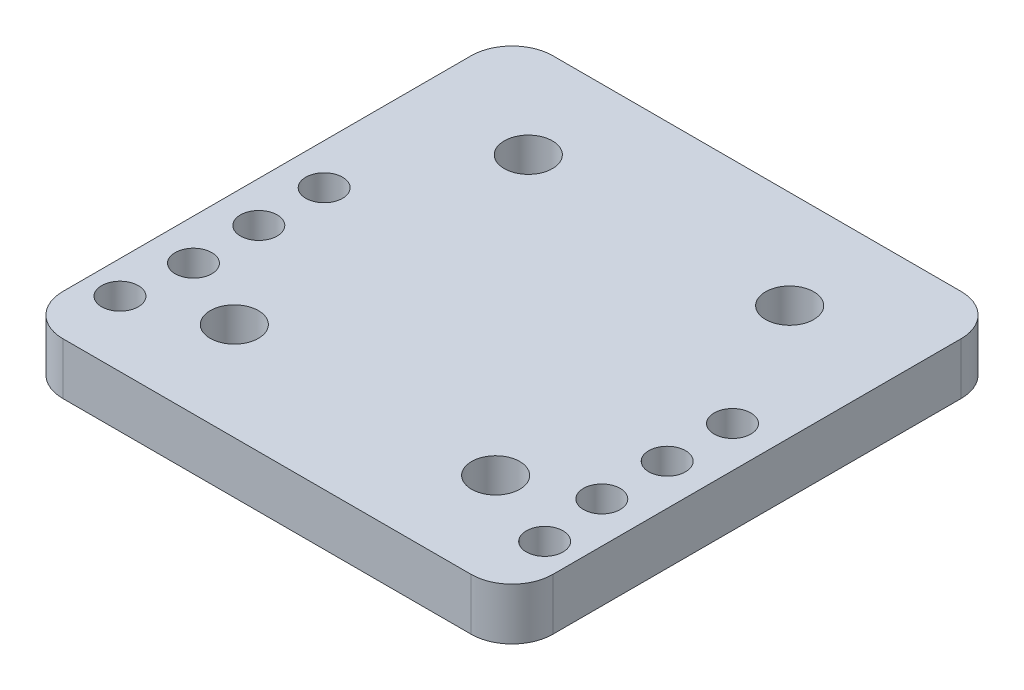
ISO-10303-21;
HEADER;
FILE_DESCRIPTION(('STEP AP214'),'2;1');
FILE_NAME('part.step','',(''),(''),'','','');
FILE_SCHEMA(('AUTOMOTIVE_DESIGN { 1 0 10303 214 1 1 1 1 }'));
ENDSEC;
DATA;
#1=APPLICATION_CONTEXT('core data for automotive mechanical design processes');
#2=APPLICATION_PROTOCOL_DEFINITION('international standard','automotive_design',2000,#1);
#3=PRODUCT_CONTEXT('',#1,'mechanical');
#4=PRODUCT('Part','Part','',(#3));
#5=PRODUCT_RELATED_PRODUCT_CATEGORY('part','',(#4));
#6=PRODUCT_DEFINITION_FORMATION('','',#4);
#7=PRODUCT_DEFINITION_CONTEXT('part definition',#1,'design');
#8=PRODUCT_DEFINITION('design','',#6,#7);
#9=PRODUCT_DEFINITION_SHAPE('','',#8);
#10=(LENGTH_UNIT() NAMED_UNIT(*) SI_UNIT(.MILLI.,.METRE.));
#11=(NAMED_UNIT(*) PLANE_ANGLE_UNIT() SI_UNIT($,.RADIAN.));
#12=(NAMED_UNIT(*) SI_UNIT($,.STERADIAN.) SOLID_ANGLE_UNIT());
#13=UNCERTAINTY_MEASURE_WITH_UNIT(LENGTH_MEASURE(1.E-05),#10,'distance_accuracy_value','');
#14=(GEOMETRIC_REPRESENTATION_CONTEXT(3) GLOBAL_UNCERTAINTY_ASSIGNED_CONTEXT((#13)) GLOBAL_UNIT_ASSIGNED_CONTEXT((#10,
#11,#12)) REPRESENTATION_CONTEXT('',''));
#15=CARTESIAN_POINT('',(0.,0.,0.));
#16=DIRECTION('',(0.,0.,1.));
#17=DIRECTION('',(1.,0.,0.));
#18=AXIS2_PLACEMENT_3D('',#15,#16,#17);
#19=CARTESIAN_POINT('',(0.,6.35,0.));
#20=DIRECTION('',(0.,-1.,0.));
#21=DIRECTION('',(0.,0.,-1.));
#22=AXIS2_PLACEMENT_3D('',#19,#20,#21);
#23=PLANE('',#22);
#24=DIRECTION('',(-1.,0.,0.));
#25=VECTOR('',#24,1.);
#26=CARTESIAN_POINT('',(0.,6.35,-60.));
#27=LINE('',#26,#25);
#28=CARTESIAN_POINT('',(55.,6.35,-60.));
#29=VERTEX_POINT('',#28);
#30=CARTESIAN_POINT('',(5.,6.35,-60.));
#31=VERTEX_POINT('',#30);
#32=EDGE_CURVE('E154',#29,#31,#27,.T.);
#33=ORIENTED_EDGE('',*,*,#32,.T.);
#34=CARTESIAN_POINT('',(5.,6.35,-55.));
#35=DIRECTION('',(0.,-1.,0.));
#36=DIRECTION('',(0.,0.,-1.));
#37=AXIS2_PLACEMENT_3D('',#34,#35,#36);
#38=CIRCLE('',#37,5.);
#39=CARTESIAN_POINT('',(0.,6.35,-55.));
#40=VERTEX_POINT('',#39);
#41=EDGE_CURVE('E183',#31,#40,#38,.F.);
#42=ORIENTED_EDGE('',*,*,#41,.T.);
#43=DIRECTION('',(0.,0.,1.));
#44=VECTOR('',#43,1.);
#45=CARTESIAN_POINT('',(0.,6.35,0.));
#46=LINE('',#45,#44);
#47=CARTESIAN_POINT('',(0.,6.35,-5.));
#48=VERTEX_POINT('',#47);
#49=EDGE_CURVE('E132',#40,#48,#46,.T.);
#50=ORIENTED_EDGE('',*,*,#49,.T.);
#51=CARTESIAN_POINT('',(5.,6.35,-5.));
#52=DIRECTION('',(0.,-1.,0.));
#53=DIRECTION('',(0.,0.,-1.));
#54=AXIS2_PLACEMENT_3D('',#51,#52,#53);
#55=CIRCLE('',#54,5.);
#56=CARTESIAN_POINT('',(5.,6.35,0.));
#57=VERTEX_POINT('',#56);
#58=EDGE_CURVE('E178',#48,#57,#55,.F.);
#59=ORIENTED_EDGE('',*,*,#58,.T.);
#60=DIRECTION('',(1.,0.,0.));
#61=VECTOR('',#60,1.);
#62=CARTESIAN_POINT('',(0.,6.35,0.));
#63=LINE('',#62,#61);
#64=CARTESIAN_POINT('',(55.,6.35,0.));
#65=VERTEX_POINT('',#64);
#66=EDGE_CURVE('E198',#57,#65,#63,.T.);
#67=ORIENTED_EDGE('',*,*,#66,.T.);
#68=CARTESIAN_POINT('',(55.,6.35,-5.));
#69=DIRECTION('',(0.,-1.,0.));
#70=DIRECTION('',(0.,0.,-1.));
#71=AXIS2_PLACEMENT_3D('',#68,#69,#70);
#72=CIRCLE('',#71,5.);
#73=CARTESIAN_POINT('',(60.,6.35,-5.));
#74=VERTEX_POINT('',#73);
#75=EDGE_CURVE('E67',#65,#74,#72,.F.);
#76=ORIENTED_EDGE('',*,*,#75,.T.);
#77=DIRECTION('',(0.,0.,-1.));
#78=VECTOR('',#77,1.);
#79=CARTESIAN_POINT('',(60.,6.35,0.));
#80=LINE('',#79,#78);
#81=CARTESIAN_POINT('',(60.,6.35,-55.));
#82=VERTEX_POINT('',#81);
#83=EDGE_CURVE('E206',#74,#82,#80,.T.);
#84=ORIENTED_EDGE('',*,*,#83,.T.);
#85=CARTESIAN_POINT('',(55.,6.35,-55.));
#86=DIRECTION('',(0.,-1.,0.));
#87=DIRECTION('',(0.,0.,-1.));
#88=AXIS2_PLACEMENT_3D('',#85,#86,#87);
#89=CIRCLE('',#88,5.);
#90=EDGE_CURVE('E175',#82,#29,#89,.F.);
#91=ORIENTED_EDGE('',*,*,#90,.T.);
#92=EDGE_LOOP('',(#33,#42,#50,#59,#67,#76,#84,#91));
#93=FACE_BOUND('',#92,.T.);
#94=CARTESIAN_POINT('',(14.,6.35,-48.));
#95=DIRECTION('',(0.,1.,0.));
#96=DIRECTION('',(0.,0.,1.));
#97=AXIS2_PLACEMENT_3D('',#94,#95,#96);
#98=CIRCLE('',#97,2.95);
#99=CARTESIAN_POINT('',(14.,6.35,-45.05));
#100=VERTEX_POINT('',#99);
#101=EDGE_CURVE('E143',#100,#100,#98,.T.);
#102=ORIENTED_EDGE('',*,*,#101,.F.);
#103=EDGE_LOOP('',(#102));
#104=FACE_BOUND('',#103,.T.);
#105=CARTESIAN_POINT('',(46.,6.35,-48.));
#106=DIRECTION('',(0.,1.,0.));
#107=DIRECTION('',(0.,0.,1.));
#108=AXIS2_PLACEMENT_3D('',#105,#106,#107);
#109=CIRCLE('',#108,2.95000000000001);
#110=CARTESIAN_POINT('',(46.,6.35,-45.05));
#111=VERTEX_POINT('',#110);
#112=EDGE_CURVE('E218',#111,#111,#109,.T.);
#113=ORIENTED_EDGE('',*,*,#112,.F.);
#114=EDGE_LOOP('',(#113));
#115=FACE_BOUND('',#114,.T.);
#116=CARTESIAN_POINT('',(46.,6.35,-12.));
#117=DIRECTION('',(0.,1.,0.));
#118=DIRECTION('',(0.,0.,1.));
#119=AXIS2_PLACEMENT_3D('',#116,#117,#118);
#120=CIRCLE('',#119,2.95);
#121=CARTESIAN_POINT('',(46.,6.35,-9.05));
#122=VERTEX_POINT('',#121);
#123=EDGE_CURVE('E224',#122,#122,#120,.T.);
#124=ORIENTED_EDGE('',*,*,#123,.F.);
#125=EDGE_LOOP('',(#124));
#126=FACE_BOUND('',#125,.T.);
#127=CARTESIAN_POINT('',(14.,6.35,-12.));
#128=DIRECTION('',(0.,1.,0.));
#129=DIRECTION('',(0.,0.,1.));
#130=AXIS2_PLACEMENT_3D('',#127,#128,#129);
#131=CIRCLE('',#130,2.95);
#132=CARTESIAN_POINT('',(14.,6.35,-9.05));
#133=VERTEX_POINT('',#132);
#134=EDGE_CURVE('E232',#133,#133,#131,.T.);
#135=ORIENTED_EDGE('',*,*,#134,.F.);
#136=EDGE_LOOP('',(#135));
#137=FACE_BOUND('',#136,.T.);
#138=CARTESIAN_POINT('',(56.,6.35,-8.));
#139=DIRECTION('',(0.,1.,0.));
#140=DIRECTION('',(0.,0.,1.));
#141=AXIS2_PLACEMENT_3D('',#138,#139,#140);
#142=CIRCLE('',#141,2.25);
#143=CARTESIAN_POINT('',(56.,6.35,-5.75));
#144=VERTEX_POINT('',#143);
#145=EDGE_CURVE('E240',#144,#144,#142,.T.);
#146=ORIENTED_EDGE('',*,*,#145,.F.);
#147=EDGE_LOOP('',(#146));
#148=FACE_BOUND('',#147,.T.);
#149=CARTESIAN_POINT('',(4.,6.35,-7.99999999999999));
#150=DIRECTION('',(0.,1.,0.));
#151=DIRECTION('',(0.,0.,-1.));
#152=AXIS2_PLACEMENT_3D('',#149,#150,#151);
#153=CIRCLE('',#152,2.25);
#154=CARTESIAN_POINT('',(4.,6.35,-10.25));
#155=VERTEX_POINT('',#154);
#156=EDGE_CURVE('E248',#155,#155,#153,.T.);
#157=ORIENTED_EDGE('',*,*,#156,.F.);
#158=EDGE_LOOP('',(#157));
#159=FACE_BOUND('',#158,.T.);
#160=CARTESIAN_POINT('',(55.,6.35,-16.));
#161=DIRECTION('',(0.,1.,0.));
#162=DIRECTION('',(0.,0.,1.));
#163=AXIS2_PLACEMENT_3D('',#160,#161,#162);
#164=CIRCLE('',#163,2.25);
#165=CARTESIAN_POINT('',(55.,6.35,-13.75));
#166=VERTEX_POINT('',#165);
#167=EDGE_CURVE('E256',#166,#166,#164,.T.);
#168=ORIENTED_EDGE('',*,*,#167,.F.);
#169=EDGE_LOOP('',(#168));
#170=FACE_BOUND('',#169,.T.);
#171=CARTESIAN_POINT('',(55.,6.35,-24.));
#172=DIRECTION('',(0.,1.,0.));
#173=DIRECTION('',(0.,0.,1.));
#174=AXIS2_PLACEMENT_3D('',#171,#172,#173);
#175=CIRCLE('',#174,2.25);
#176=CARTESIAN_POINT('',(55.,6.35,-21.75));
#177=VERTEX_POINT('',#176);
#178=EDGE_CURVE('E264',#177,#177,#175,.T.);
#179=ORIENTED_EDGE('',*,*,#178,.F.);
#180=EDGE_LOOP('',(#179));
#181=FACE_BOUND('',#180,.T.);
#182=CARTESIAN_POINT('',(54.9999999999999,6.35,-32.));
#183=DIRECTION('',(0.,1.,0.));
#184=DIRECTION('',(0.,0.,1.));
#185=AXIS2_PLACEMENT_3D('',#182,#183,#184);
#186=CIRCLE('',#185,2.25);
#187=CARTESIAN_POINT('',(54.9999999999999,6.35,-29.75));
#188=VERTEX_POINT('',#187);
#189=EDGE_CURVE('E272',#188,#188,#186,.T.);
#190=ORIENTED_EDGE('',*,*,#189,.F.);
#191=EDGE_LOOP('',(#190));
#192=FACE_BOUND('',#191,.T.);
#193=CARTESIAN_POINT('',(5.00000000000005,6.35,-32.));
#194=DIRECTION('',(0.,1.,0.));
#195=DIRECTION('',(0.,0.,-1.));
#196=AXIS2_PLACEMENT_3D('',#193,#194,#195);
#197=CIRCLE('',#196,2.25);
#198=CARTESIAN_POINT('',(5.00000000000005,6.35,-34.25));
#199=VERTEX_POINT('',#198);
#200=EDGE_CURVE('E280',#199,#199,#197,.T.);
#201=ORIENTED_EDGE('',*,*,#200,.F.);
#202=EDGE_LOOP('',(#201));
#203=FACE_BOUND('',#202,.T.);
#204=CARTESIAN_POINT('',(5.00000000000002,6.35,-24.));
#205=DIRECTION('',(0.,1.,0.));
#206=DIRECTION('',(0.,0.,-1.));
#207=AXIS2_PLACEMENT_3D('',#204,#205,#206);
#208=CIRCLE('',#207,2.25);
#209=CARTESIAN_POINT('',(5.00000000000002,6.35,-26.25));
#210=VERTEX_POINT('',#209);
#211=EDGE_CURVE('E288',#210,#210,#208,.T.);
#212=ORIENTED_EDGE('',*,*,#211,.F.);
#213=EDGE_LOOP('',(#212));
#214=FACE_BOUND('',#213,.T.);
#215=CARTESIAN_POINT('',(5.,6.35,-16.));
#216=DIRECTION('',(0.,1.,0.));
#217=DIRECTION('',(0.,0.,-1.));
#218=AXIS2_PLACEMENT_3D('',#215,#216,#217);
#219=CIRCLE('',#218,2.25);
#220=CARTESIAN_POINT('',(5.,6.35,-18.25));
#221=VERTEX_POINT('',#220);
#222=EDGE_CURVE('E296',#221,#221,#219,.T.);
#223=ORIENTED_EDGE('',*,*,#222,.F.);
#224=EDGE_LOOP('',(#223));
#225=FACE_BOUND('',#224,.T.);
#226=ADVANCED_FACE('F44',(#93,#104,#115,#126,#137,#148,#159,#170,#181,#192,#203,#214,#225),#23,.F.);
#227=CARTESIAN_POINT('',(0.,0.,0.));
#228=DIRECTION('',(0.,-1.,0.));
#229=DIRECTION('',(0.,0.,-1.));
#230=AXIS2_PLACEMENT_3D('',#227,#228,#229);
#231=PLANE('',#230);
#232=CARTESIAN_POINT('',(5.00000000000002,0.,-24.));
#233=DIRECTION('',(0.,1.,0.));
#234=DIRECTION('',(0.,0.,-1.));
#235=AXIS2_PLACEMENT_3D('',#232,#233,#234);
#236=CIRCLE('',#235,2.25);
#237=CARTESIAN_POINT('',(5.00000000000002,0.,-26.25));
#238=VERTEX_POINT('',#237);
#239=EDGE_CURVE('E292',#238,#238,#236,.T.);
#240=ORIENTED_EDGE('',*,*,#239,.T.);
#241=EDGE_LOOP('',(#240));
#242=FACE_BOUND('',#241,.T.);
#243=CARTESIAN_POINT('',(54.9999999999999,0.,-32.));
#244=DIRECTION('',(0.,1.,0.));
#245=DIRECTION('',(0.,0.,1.));
#246=AXIS2_PLACEMENT_3D('',#243,#244,#245);
#247=CIRCLE('',#246,2.25);
#248=CARTESIAN_POINT('',(54.9999999999999,0.,-29.75));
#249=VERTEX_POINT('',#248);
#250=EDGE_CURVE('E276',#249,#249,#247,.T.);
#251=ORIENTED_EDGE('',*,*,#250,.T.);
#252=EDGE_LOOP('',(#251));
#253=FACE_BOUND('',#252,.T.);
#254=CARTESIAN_POINT('',(55.,0.,-16.));
#255=DIRECTION('',(0.,1.,0.));
#256=DIRECTION('',(0.,0.,1.));
#257=AXIS2_PLACEMENT_3D('',#254,#255,#256);
#258=CIRCLE('',#257,2.25);
#259=CARTESIAN_POINT('',(55.,0.,-13.75));
#260=VERTEX_POINT('',#259);
#261=EDGE_CURVE('E260',#260,#260,#258,.T.);
#262=ORIENTED_EDGE('',*,*,#261,.T.);
#263=EDGE_LOOP('',(#262));
#264=FACE_BOUND('',#263,.T.);
#265=CARTESIAN_POINT('',(56.,0.,-8.));
#266=DIRECTION('',(0.,1.,0.));
#267=DIRECTION('',(0.,0.,1.));
#268=AXIS2_PLACEMENT_3D('',#265,#266,#267);
#269=CIRCLE('',#268,2.25);
#270=CARTESIAN_POINT('',(56.,0.,-5.75));
#271=VERTEX_POINT('',#270);
#272=EDGE_CURVE('E244',#271,#271,#269,.T.);
#273=ORIENTED_EDGE('',*,*,#272,.T.);
#274=EDGE_LOOP('',(#273));
#275=FACE_BOUND('',#274,.T.);
#276=CARTESIAN_POINT('',(46.,0.,-12.));
#277=DIRECTION('',(0.,1.,0.));
#278=DIRECTION('',(0.,0.,1.));
#279=AXIS2_PLACEMENT_3D('',#276,#277,#278);
#280=CIRCLE('',#279,2.95);
#281=CARTESIAN_POINT('',(46.,0.,-9.05));
#282=VERTEX_POINT('',#281);
#283=EDGE_CURVE('E228',#282,#282,#280,.T.);
#284=ORIENTED_EDGE('',*,*,#283,.T.);
#285=EDGE_LOOP('',(#284));
#286=FACE_BOUND('',#285,.T.);
#287=CARTESIAN_POINT('',(14.,0.,-48.));
#288=DIRECTION('',(0.,1.,0.));
#289=DIRECTION('',(0.,0.,1.));
#290=AXIS2_PLACEMENT_3D('',#287,#288,#289);
#291=CIRCLE('',#290,2.95);
#292=CARTESIAN_POINT('',(14.,0.,-45.05));
#293=VERTEX_POINT('',#292);
#294=EDGE_CURVE('E151',#293,#293,#291,.T.);
#295=ORIENTED_EDGE('',*,*,#294,.T.);
#296=EDGE_LOOP('',(#295));
#297=FACE_BOUND('',#296,.T.);
#298=DIRECTION('',(0.,0.,1.));
#299=VECTOR('',#298,1.);
#300=CARTESIAN_POINT('',(0.,0.,0.));
#301=LINE('',#300,#299);
#302=CARTESIAN_POINT('',(0.,0.,-55.));
#303=VERTEX_POINT('',#302);
#304=CARTESIAN_POINT('',(0.,0.,-5.));
#305=VERTEX_POINT('',#304);
#306=EDGE_CURVE('E129',#303,#305,#301,.T.);
#307=ORIENTED_EDGE('',*,*,#306,.F.);
#308=CARTESIAN_POINT('',(5.,0.,-55.));
#309=DIRECTION('',(0.,-1.,0.));
#310=DIRECTION('',(0.,0.,-1.));
#311=AXIS2_PLACEMENT_3D('',#308,#309,#310);
#312=CIRCLE('',#311,5.);
#313=CARTESIAN_POINT('',(5.,0.,-60.));
#314=VERTEX_POINT('',#313);
#315=EDGE_CURVE('E111',#303,#314,#312,.T.);
#316=ORIENTED_EDGE('',*,*,#315,.T.);
#317=DIRECTION('',(-1.,0.,0.));
#318=VECTOR('',#317,1.);
#319=CARTESIAN_POINT('',(0.,0.,-60.));
#320=LINE('',#319,#318);
#321=CARTESIAN_POINT('',(55.,0.,-60.));
#322=VERTEX_POINT('',#321);
#323=EDGE_CURVE('E159',#322,#314,#320,.T.);
#324=ORIENTED_EDGE('',*,*,#323,.F.);
#325=CARTESIAN_POINT('',(55.,0.,-55.));
#326=DIRECTION('',(0.,-1.,0.));
#327=DIRECTION('',(0.,0.,-1.));
#328=AXIS2_PLACEMENT_3D('',#325,#326,#327);
#329=CIRCLE('',#328,5.);
#330=CARTESIAN_POINT('',(60.,0.,-55.));
#331=VERTEX_POINT('',#330);
#332=EDGE_CURVE('E134',#322,#331,#329,.T.);
#333=ORIENTED_EDGE('',*,*,#332,.T.);
#334=DIRECTION('',(0.,0.,-1.));
#335=VECTOR('',#334,1.);
#336=CARTESIAN_POINT('',(60.,0.,0.));
#337=LINE('',#336,#335);
#338=CARTESIAN_POINT('',(60.,0.,-5.));
#339=VERTEX_POINT('',#338);
#340=EDGE_CURVE('E148',#339,#331,#337,.T.);
#341=ORIENTED_EDGE('',*,*,#340,.F.);
#342=CARTESIAN_POINT('',(55.,0.,-5.));
#343=DIRECTION('',(0.,-1.,0.));
#344=DIRECTION('',(0.,0.,-1.));
#345=AXIS2_PLACEMENT_3D('',#342,#343,#344);
#346=CIRCLE('',#345,5.);
#347=CARTESIAN_POINT('',(55.,0.,0.));
#348=VERTEX_POINT('',#347);
#349=EDGE_CURVE('E123',#339,#348,#346,.T.);
#350=ORIENTED_EDGE('',*,*,#349,.T.);
#351=DIRECTION('',(1.,0.,0.));
#352=VECTOR('',#351,1.);
#353=CARTESIAN_POINT('',(0.,0.,0.));
#354=LINE('',#353,#352);
#355=CARTESIAN_POINT('',(5.,0.,0.));
#356=VERTEX_POINT('',#355);
#357=EDGE_CURVE('E142',#356,#348,#354,.T.);
#358=ORIENTED_EDGE('',*,*,#357,.F.);
#359=CARTESIAN_POINT('',(5.,0.,-5.));
#360=DIRECTION('',(0.,-1.,0.));
#361=DIRECTION('',(0.,0.,-1.));
#362=AXIS2_PLACEMENT_3D('',#359,#360,#361);
#363=CIRCLE('',#362,5.);
#364=EDGE_CURVE('E140',#356,#305,#363,.T.);
#365=ORIENTED_EDGE('',*,*,#364,.T.);
#366=EDGE_LOOP('',(#307,#316,#324,#333,#341,#350,#358,#365));
#367=FACE_BOUND('',#366,.T.);
#368=CARTESIAN_POINT('',(46.,0.,-48.));
#369=DIRECTION('',(0.,1.,0.));
#370=DIRECTION('',(0.,0.,1.));
#371=AXIS2_PLACEMENT_3D('',#368,#369,#370);
#372=CIRCLE('',#371,2.95000000000001);
#373=CARTESIAN_POINT('',(46.,0.,-45.05));
#374=VERTEX_POINT('',#373);
#375=EDGE_CURVE('E220',#374,#374,#372,.T.);
#376=ORIENTED_EDGE('',*,*,#375,.T.);
#377=EDGE_LOOP('',(#376));
#378=FACE_BOUND('',#377,.T.);
#379=CARTESIAN_POINT('',(14.,0.,-12.));
#380=DIRECTION('',(0.,1.,0.));
#381=DIRECTION('',(0.,0.,1.));
#382=AXIS2_PLACEMENT_3D('',#379,#380,#381);
#383=CIRCLE('',#382,2.95);
#384=CARTESIAN_POINT('',(14.,0.,-9.05));
#385=VERTEX_POINT('',#384);
#386=EDGE_CURVE('E236',#385,#385,#383,.T.);
#387=ORIENTED_EDGE('',*,*,#386,.T.);
#388=EDGE_LOOP('',(#387));
#389=FACE_BOUND('',#388,.T.);
#390=CARTESIAN_POINT('',(4.,0.,-7.99999999999999));
#391=DIRECTION('',(0.,1.,0.));
#392=DIRECTION('',(0.,0.,-1.));
#393=AXIS2_PLACEMENT_3D('',#390,#391,#392);
#394=CIRCLE('',#393,2.25);
#395=CARTESIAN_POINT('',(4.,0.,-10.25));
#396=VERTEX_POINT('',#395);
#397=EDGE_CURVE('E252',#396,#396,#394,.T.);
#398=ORIENTED_EDGE('',*,*,#397,.T.);
#399=EDGE_LOOP('',(#398));
#400=FACE_BOUND('',#399,.T.);
#401=CARTESIAN_POINT('',(55.,0.,-24.));
#402=DIRECTION('',(0.,1.,0.));
#403=DIRECTION('',(0.,0.,1.));
#404=AXIS2_PLACEMENT_3D('',#401,#402,#403);
#405=CIRCLE('',#404,2.25);
#406=CARTESIAN_POINT('',(55.,0.,-21.75));
#407=VERTEX_POINT('',#406);
#408=EDGE_CURVE('E268',#407,#407,#405,.T.);
#409=ORIENTED_EDGE('',*,*,#408,.T.);
#410=EDGE_LOOP('',(#409));
#411=FACE_BOUND('',#410,.T.);
#412=CARTESIAN_POINT('',(5.00000000000005,0.,-32.));
#413=DIRECTION('',(0.,1.,0.));
#414=DIRECTION('',(0.,0.,-1.));
#415=AXIS2_PLACEMENT_3D('',#412,#413,#414);
#416=CIRCLE('',#415,2.25);
#417=CARTESIAN_POINT('',(5.00000000000005,0.,-34.25));
#418=VERTEX_POINT('',#417);
#419=EDGE_CURVE('E284',#418,#418,#416,.T.);
#420=ORIENTED_EDGE('',*,*,#419,.T.);
#421=EDGE_LOOP('',(#420));
#422=FACE_BOUND('',#421,.T.);
#423=CARTESIAN_POINT('',(5.,0.,-16.));
#424=DIRECTION('',(0.,1.,0.));
#425=DIRECTION('',(0.,0.,-1.));
#426=AXIS2_PLACEMENT_3D('',#423,#424,#425);
#427=CIRCLE('',#426,2.25);
#428=CARTESIAN_POINT('',(5.,0.,-18.25));
#429=VERTEX_POINT('',#428);
#430=EDGE_CURVE('E300',#429,#429,#427,.T.);
#431=ORIENTED_EDGE('',*,*,#430,.T.);
#432=EDGE_LOOP('',(#431));
#433=FACE_BOUND('',#432,.T.);
#434=ADVANCED_FACE('F137',(#242,#253,#264,#275,#286,#297,#367,#378,#389,#400,#411,#422,#433),
#231,.T.);
#435=CARTESIAN_POINT('',(0.,6.35,0.));
#436=DIRECTION('',(1.,0.,0.));
#437=DIRECTION('',(0.,0.,-1.));
#438=AXIS2_PLACEMENT_3D('',#435,#436,#437);
#439=PLANE('',#438);
#440=ORIENTED_EDGE('',*,*,#49,.F.);
#441=DIRECTION('',(0.,-1.,0.));
#442=VECTOR('',#441,1.);
#443=CARTESIAN_POINT('',(0.,6.35,-55.));
#444=LINE('',#443,#442);
#445=EDGE_CURVE('E115',#40,#303,#444,.T.);
#446=ORIENTED_EDGE('',*,*,#445,.T.);
#447=ORIENTED_EDGE('',*,*,#306,.T.);
#448=DIRECTION('',(0.,-1.,0.));
#449=VECTOR('',#448,1.);
#450=CARTESIAN_POINT('',(0.,6.35,-5.));
#451=LINE('',#450,#449);
#452=EDGE_CURVE('E135',#305,#48,#451,.F.);
#453=ORIENTED_EDGE('',*,*,#452,.T.);
#454=EDGE_LOOP('',(#440,#446,#447,#453));
#455=FACE_BOUND('',#454,.T.);
#456=ADVANCED_FACE('F128',(#455),#439,.F.);
#457=CARTESIAN_POINT('',(0.,6.35,0.));
#458=DIRECTION('',(0.,0.,-1.));
#459=DIRECTION('',(-1.,0.,0.));
#460=AXIS2_PLACEMENT_3D('',#457,#458,#459);
#461=PLANE('',#460);
#462=ORIENTED_EDGE('',*,*,#357,.T.);
#463=DIRECTION('',(0.,-1.,0.));
#464=VECTOR('',#463,1.);
#465=CARTESIAN_POINT('',(55.,6.35,0.));
#466=LINE('',#465,#464);
#467=EDGE_CURVE('E11',#348,#65,#466,.F.);
#468=ORIENTED_EDGE('',*,*,#467,.T.);
#469=ORIENTED_EDGE('',*,*,#66,.F.);
#470=DIRECTION('',(0.,-1.,0.));
#471=VECTOR('',#470,1.);
#472=CARTESIAN_POINT('',(5.,6.35,0.));
#473=LINE('',#472,#471);
#474=EDGE_CURVE('E53',#57,#356,#473,.T.);
#475=ORIENTED_EDGE('',*,*,#474,.T.);
#476=EDGE_LOOP('',(#462,#468,#469,#475));
#477=FACE_BOUND('',#476,.T.);
#478=ADVANCED_FACE('F196',(#477),#461,.F.);
#479=CARTESIAN_POINT('',(60.,6.35,0.));
#480=DIRECTION('',(-1.,0.,0.));
#481=DIRECTION('',(0.,0.,1.));
#482=AXIS2_PLACEMENT_3D('',#479,#480,#481);
#483=PLANE('',#482);
#484=ORIENTED_EDGE('',*,*,#83,.F.);
#485=DIRECTION('',(0.,-1.,0.));
#486=VECTOR('',#485,1.);
#487=CARTESIAN_POINT('',(60.,6.35,-5.));
#488=LINE('',#487,#486);
#489=EDGE_CURVE('E188',#74,#339,#488,.T.);
#490=ORIENTED_EDGE('',*,*,#489,.T.);
#491=ORIENTED_EDGE('',*,*,#340,.T.);
#492=DIRECTION('',(0.,-1.,0.));
#493=VECTOR('',#492,1.);
#494=CARTESIAN_POINT('',(60.,6.35,-55.));
#495=LINE('',#494,#493);
#496=EDGE_CURVE('E60',#331,#82,#495,.F.);
#497=ORIENTED_EDGE('',*,*,#496,.T.);
#498=EDGE_LOOP('',(#484,#490,#491,#497));
#499=FACE_BOUND('',#498,.T.);
#500=ADVANCED_FACE('F205',(#499),#483,.F.);
#501=CARTESIAN_POINT('',(0.,6.35,-60.));
#502=DIRECTION('',(0.,0.,1.));
#503=DIRECTION('',(1.,0.,0.));
#504=AXIS2_PLACEMENT_3D('',#501,#502,#503);
#505=PLANE('',#504);
#506=ORIENTED_EDGE('',*,*,#323,.T.);
#507=DIRECTION('',(0.,-1.,0.));
#508=VECTOR('',#507,1.);
#509=CARTESIAN_POINT('',(5.,6.35,-60.));
#510=LINE('',#509,#508);
#511=EDGE_CURVE('E116',#314,#31,#510,.F.);
#512=ORIENTED_EDGE('',*,*,#511,.T.);
#513=ORIENTED_EDGE('',*,*,#32,.F.);
#514=DIRECTION('',(0.,-1.,0.));
#515=VECTOR('',#514,1.);
#516=CARTESIAN_POINT('',(55.,6.35,-60.));
#517=LINE('',#516,#515);
#518=EDGE_CURVE('E122',#29,#322,#517,.T.);
#519=ORIENTED_EDGE('',*,*,#518,.T.);
#520=EDGE_LOOP('',(#506,#512,#513,#519));
#521=FACE_BOUND('',#520,.T.);
#522=ADVANCED_FACE('F324',(#521),#505,.F.);
#523=CARTESIAN_POINT('',(14.,6.35,-48.));
#524=DIRECTION('',(0.,-1.,0.));
#525=DIRECTION('',(0.,0.,-1.));
#526=AXIS2_PLACEMENT_3D('',#523,#524,#525);
#527=CYLINDRICAL_SURFACE('',#526,2.95);
#528=ORIENTED_EDGE('',*,*,#101,.T.);
#529=EDGE_LOOP('',(#528));
#530=FACE_BOUND('',#529,.T.);
#531=ORIENTED_EDGE('',*,*,#294,.F.);
#532=EDGE_LOOP('',(#531));
#533=FACE_BOUND('',#532,.T.);
#534=ADVANCED_FACE('F321',(#530,#533),#527,.F.);
#535=CARTESIAN_POINT('',(46.,6.35,-48.));
#536=DIRECTION('',(0.,-1.,0.));
#537=DIRECTION('',(0.,0.,-1.));
#538=AXIS2_PLACEMENT_3D('',#535,#536,#537);
#539=CYLINDRICAL_SURFACE('',#538,2.95000000000001);
#540=ORIENTED_EDGE('',*,*,#112,.T.);
#541=EDGE_LOOP('',(#540));
#542=FACE_BOUND('',#541,.T.);
#543=ORIENTED_EDGE('',*,*,#375,.F.);
#544=EDGE_LOOP('',(#543));
#545=FACE_BOUND('',#544,.T.);
#546=ADVANCED_FACE('F461',(#542,#545),#539,.F.);
#547=CARTESIAN_POINT('',(46.,6.35,-12.));
#548=DIRECTION('',(0.,-1.,0.));
#549=DIRECTION('',(0.,0.,-1.));
#550=AXIS2_PLACEMENT_3D('',#547,#548,#549);
#551=CYLINDRICAL_SURFACE('',#550,2.95);
#552=ORIENTED_EDGE('',*,*,#123,.T.);
#553=EDGE_LOOP('',(#552));
#554=FACE_BOUND('',#553,.T.);
#555=ORIENTED_EDGE('',*,*,#283,.F.);
#556=EDGE_LOOP('',(#555));
#557=FACE_BOUND('',#556,.T.);
#558=ADVANCED_FACE('F451',(#554,#557),#551,.F.);
#559=CARTESIAN_POINT('',(14.,6.35,-12.));
#560=DIRECTION('',(0.,-1.,0.));
#561=DIRECTION('',(0.,0.,-1.));
#562=AXIS2_PLACEMENT_3D('',#559,#560,#561);
#563=CYLINDRICAL_SURFACE('',#562,2.95);
#564=ORIENTED_EDGE('',*,*,#134,.T.);
#565=EDGE_LOOP('',(#564));
#566=FACE_BOUND('',#565,.T.);
#567=ORIENTED_EDGE('',*,*,#386,.F.);
#568=EDGE_LOOP('',(#567));
#569=FACE_BOUND('',#568,.T.);
#570=ADVANCED_FACE('F441',(#566,#569),#563,.F.);
#571=CARTESIAN_POINT('',(56.,6.35,-8.));
#572=DIRECTION('',(0.,-1.,0.));
#573=DIRECTION('',(0.,0.,-1.));
#574=AXIS2_PLACEMENT_3D('',#571,#572,#573);
#575=CYLINDRICAL_SURFACE('',#574,2.25);
#576=ORIENTED_EDGE('',*,*,#145,.T.);
#577=EDGE_LOOP('',(#576));
#578=FACE_BOUND('',#577,.T.);
#579=ORIENTED_EDGE('',*,*,#272,.F.);
#580=EDGE_LOOP('',(#579));
#581=FACE_BOUND('',#580,.T.);
#582=ADVANCED_FACE('F431',(#578,#581),#575,.F.);
#583=CARTESIAN_POINT('',(4.,6.35,-7.99999999999999));
#584=DIRECTION('',(0.,-1.,0.));
#585=DIRECTION('',(0.,0.,-1.));
#586=AXIS2_PLACEMENT_3D('',#583,#584,#585);
#587=CYLINDRICAL_SURFACE('',#586,2.25);
#588=ORIENTED_EDGE('',*,*,#156,.T.);
#589=EDGE_LOOP('',(#588));
#590=FACE_BOUND('',#589,.T.);
#591=ORIENTED_EDGE('',*,*,#397,.F.);
#592=EDGE_LOOP('',(#591));
#593=FACE_BOUND('',#592,.T.);
#594=ADVANCED_FACE('F421',(#590,#593),#587,.F.);
#595=CARTESIAN_POINT('',(55.,6.35,-16.));
#596=DIRECTION('',(0.,-1.,0.));
#597=DIRECTION('',(0.,0.,-1.));
#598=AXIS2_PLACEMENT_3D('',#595,#596,#597);
#599=CYLINDRICAL_SURFACE('',#598,2.25);
#600=ORIENTED_EDGE('',*,*,#167,.T.);
#601=EDGE_LOOP('',(#600));
#602=FACE_BOUND('',#601,.T.);
#603=ORIENTED_EDGE('',*,*,#261,.F.);
#604=EDGE_LOOP('',(#603));
#605=FACE_BOUND('',#604,.T.);
#606=ADVANCED_FACE('F411',(#602,#605),#599,.F.);
#607=CARTESIAN_POINT('',(55.,6.35,-24.));
#608=DIRECTION('',(0.,-1.,0.));
#609=DIRECTION('',(0.,0.,-1.));
#610=AXIS2_PLACEMENT_3D('',#607,#608,#609);
#611=CYLINDRICAL_SURFACE('',#610,2.25);
#612=ORIENTED_EDGE('',*,*,#178,.T.);
#613=EDGE_LOOP('',(#612));
#614=FACE_BOUND('',#613,.T.);
#615=ORIENTED_EDGE('',*,*,#408,.F.);
#616=EDGE_LOOP('',(#615));
#617=FACE_BOUND('',#616,.T.);
#618=ADVANCED_FACE('F401',(#614,#617),#611,.F.);
#619=CARTESIAN_POINT('',(54.9999999999999,6.35,-32.));
#620=DIRECTION('',(0.,-1.,0.));
#621=DIRECTION('',(0.,0.,-1.));
#622=AXIS2_PLACEMENT_3D('',#619,#620,#621);
#623=CYLINDRICAL_SURFACE('',#622,2.25);
#624=ORIENTED_EDGE('',*,*,#189,.T.);
#625=EDGE_LOOP('',(#624));
#626=FACE_BOUND('',#625,.T.);
#627=ORIENTED_EDGE('',*,*,#250,.F.);
#628=EDGE_LOOP('',(#627));
#629=FACE_BOUND('',#628,.T.);
#630=ADVANCED_FACE('F391',(#626,#629),#623,.F.);
#631=CARTESIAN_POINT('',(5.00000000000005,6.35,-32.));
#632=DIRECTION('',(0.,-1.,0.));
#633=DIRECTION('',(0.,0.,-1.));
#634=AXIS2_PLACEMENT_3D('',#631,#632,#633);
#635=CYLINDRICAL_SURFACE('',#634,2.25);
#636=ORIENTED_EDGE('',*,*,#200,.T.);
#637=EDGE_LOOP('',(#636));
#638=FACE_BOUND('',#637,.T.);
#639=ORIENTED_EDGE('',*,*,#419,.F.);
#640=EDGE_LOOP('',(#639));
#641=FACE_BOUND('',#640,.T.);
#642=ADVANCED_FACE('F381',(#638,#641),#635,.F.);
#643=CARTESIAN_POINT('',(5.00000000000002,6.35,-24.));
#644=DIRECTION('',(0.,-1.,0.));
#645=DIRECTION('',(0.,0.,-1.));
#646=AXIS2_PLACEMENT_3D('',#643,#644,#645);
#647=CYLINDRICAL_SURFACE('',#646,2.25);
#648=ORIENTED_EDGE('',*,*,#211,.T.);
#649=EDGE_LOOP('',(#648));
#650=FACE_BOUND('',#649,.T.);
#651=ORIENTED_EDGE('',*,*,#239,.F.);
#652=EDGE_LOOP('',(#651));
#653=FACE_BOUND('',#652,.T.);
#654=ADVANCED_FACE('F372',(#650,#653),#647,.F.);
#655=CARTESIAN_POINT('',(5.,6.35,-16.));
#656=DIRECTION('',(0.,-1.,0.));
#657=DIRECTION('',(0.,0.,-1.));
#658=AXIS2_PLACEMENT_3D('',#655,#656,#657);
#659=CYLINDRICAL_SURFACE('',#658,2.25);
#660=ORIENTED_EDGE('',*,*,#222,.T.);
#661=EDGE_LOOP('',(#660));
#662=FACE_BOUND('',#661,.T.);
#663=ORIENTED_EDGE('',*,*,#430,.F.);
#664=EDGE_LOOP('',(#663));
#665=FACE_BOUND('',#664,.T.);
#666=ADVANCED_FACE('F308',(#662,#665),#659,.F.);
#667=CARTESIAN_POINT('',(5.,6.35,-55.));
#668=DIRECTION('',(0.,-1.,0.));
#669=DIRECTION('',(0.,0.,-1.));
#670=AXIS2_PLACEMENT_3D('',#667,#668,#669);
#671=CYLINDRICAL_SURFACE('',#670,5.);
#672=ORIENTED_EDGE('',*,*,#41,.F.);
#673=ORIENTED_EDGE('',*,*,#511,.F.);
#674=ORIENTED_EDGE('',*,*,#315,.F.);
#675=ORIENTED_EDGE('',*,*,#445,.F.);
#676=EDGE_LOOP('',(#672,#673,#674,#675));
#677=FACE_BOUND('',#676,.T.);
#678=ADVANCED_FACE('F114',(#677),#671,.T.);
#679=CARTESIAN_POINT('',(55.,6.35,-5.));
#680=DIRECTION('',(0.,-1.,0.));
#681=DIRECTION('',(0.,0.,-1.));
#682=AXIS2_PLACEMENT_3D('',#679,#680,#681);
#683=CYLINDRICAL_SURFACE('',#682,5.);
#684=ORIENTED_EDGE('',*,*,#75,.F.);
#685=ORIENTED_EDGE('',*,*,#467,.F.);
#686=ORIENTED_EDGE('',*,*,#349,.F.);
#687=ORIENTED_EDGE('',*,*,#489,.F.);
#688=EDGE_LOOP('',(#684,#685,#686,#687));
#689=FACE_BOUND('',#688,.T.);
#690=ADVANCED_FACE('F204',(#689),#683,.T.);
#691=CARTESIAN_POINT('',(5.,6.35,-5.));
#692=DIRECTION('',(0.,-1.,0.));
#693=DIRECTION('',(0.,0.,-1.));
#694=AXIS2_PLACEMENT_3D('',#691,#692,#693);
#695=CYLINDRICAL_SURFACE('',#694,5.);
#696=ORIENTED_EDGE('',*,*,#58,.F.);
#697=ORIENTED_EDGE('',*,*,#452,.F.);
#698=ORIENTED_EDGE('',*,*,#364,.F.);
#699=ORIENTED_EDGE('',*,*,#474,.F.);
#700=EDGE_LOOP('',(#696,#697,#698,#699));
#701=FACE_BOUND('',#700,.T.);
#702=ADVANCED_FACE('F337',(#701),#695,.T.);
#703=CARTESIAN_POINT('',(55.,6.35,-55.));
#704=DIRECTION('',(0.,-1.,0.));
#705=DIRECTION('',(0.,0.,-1.));
#706=AXIS2_PLACEMENT_3D('',#703,#704,#705);
#707=CYLINDRICAL_SURFACE('',#706,5.);
#708=ORIENTED_EDGE('',*,*,#90,.F.);
#709=ORIENTED_EDGE('',*,*,#496,.F.);
#710=ORIENTED_EDGE('',*,*,#332,.F.);
#711=ORIENTED_EDGE('',*,*,#518,.F.);
#712=EDGE_LOOP('',(#708,#709,#710,#711));
#713=FACE_BOUND('',#712,.T.);
#714=ADVANCED_FACE('F46',(#713),#707,.T.);
#715=CLOSED_SHELL('',(#226,#434,#456,#478,#500,#522,#534,#546,#558,#570,#582,#594,#606,#618,
#630,#642,#654,#666,#678,#690,#702,#714));
#716=MANIFOLD_SOLID_BREP('B2',#715);
#717=ADVANCED_BREP_SHAPE_REPRESENTATION('',(#18,#716),#14);
#718=SHAPE_DEFINITION_REPRESENTATION(#9,#717);
ENDSEC;
END-ISO-10303-21;
